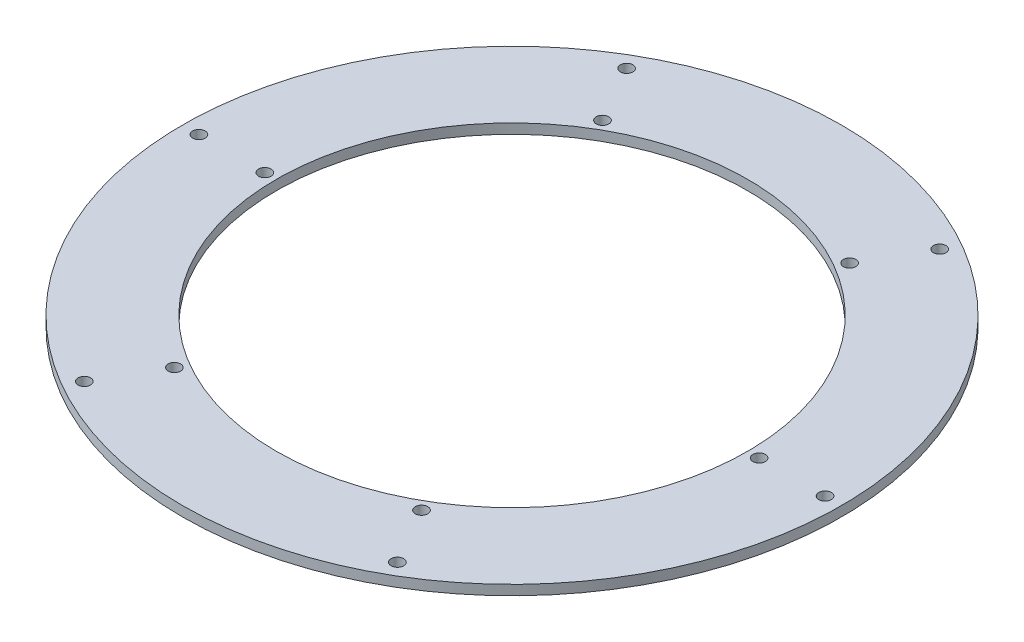
ISO-10303-21;
HEADER;
FILE_DESCRIPTION(('STEP AP214'),'2;1');
FILE_NAME('part.step','',(''),(''),'','','');
FILE_SCHEMA(('AUTOMOTIVE_DESIGN { 1 0 10303 214 1 1 1 1 }'));
ENDSEC;
DATA;
#1=APPLICATION_CONTEXT('core data for automotive mechanical design processes');
#2=APPLICATION_PROTOCOL_DEFINITION('international standard','automotive_design',2000,#1);
#3=PRODUCT_CONTEXT('',#1,'mechanical');
#4=PRODUCT('Part','Part','',(#3));
#5=PRODUCT_RELATED_PRODUCT_CATEGORY('part','',(#4));
#6=PRODUCT_DEFINITION_FORMATION('','',#4);
#7=PRODUCT_DEFINITION_CONTEXT('part definition',#1,'design');
#8=PRODUCT_DEFINITION('design','',#6,#7);
#9=PRODUCT_DEFINITION_SHAPE('','',#8);
#10=(LENGTH_UNIT() NAMED_UNIT(*) SI_UNIT(.MILLI.,.METRE.));
#11=(NAMED_UNIT(*) PLANE_ANGLE_UNIT() SI_UNIT($,.RADIAN.));
#12=(NAMED_UNIT(*) SI_UNIT($,.STERADIAN.) SOLID_ANGLE_UNIT());
#13=UNCERTAINTY_MEASURE_WITH_UNIT(LENGTH_MEASURE(1.E-05),#10,'distance_accuracy_value','');
#14=(GEOMETRIC_REPRESENTATION_CONTEXT(3) GLOBAL_UNCERTAINTY_ASSIGNED_CONTEXT((#13)) GLOBAL_UNIT_ASSIGNED_CONTEXT((#10,
#11,#12)) REPRESENTATION_CONTEXT('',''));
#15=CARTESIAN_POINT('',(0.,0.,0.));
#16=DIRECTION('',(0.,0.,1.));
#17=DIRECTION('',(1.,0.,0.));
#18=AXIS2_PLACEMENT_3D('',#15,#16,#17);
#19=CARTESIAN_POINT('',(0.,3.,0.));
#20=DIRECTION('',(0.,1.,0.));
#21=DIRECTION('',(0.,0.,1.));
#22=AXIS2_PLACEMENT_3D('',#19,#20,#21);
#23=PLANE('',#22);
#24=CARTESIAN_POINT('',(-47.500000000001,3.,-82.2724133595211));
#25=DIRECTION('',(0.,1.,0.));
#26=DIRECTION('',(0.,0.,1.));
#27=AXIS2_PLACEMENT_3D('',#24,#25,#26);
#28=CIRCLE('',#27,1.9);
#29=CARTESIAN_POINT('',(-47.500000000001,3.,-80.3724133595211));
#30=VERTEX_POINT('',#29);
#31=EDGE_CURVE('E59',#30,#30,#28,.T.);
#32=ORIENTED_EDGE('',*,*,#31,.F.);
#33=EDGE_LOOP('',(#32));
#34=FACE_BOUND('',#33,.T.);
#35=CARTESIAN_POINT('',(37.4999999999994,3.,-64.9519052838332));
#36=DIRECTION('',(0.,1.,0.));
#37=DIRECTION('',(0.,0.,1.));
#38=AXIS2_PLACEMENT_3D('',#35,#36,#37);
#39=CIRCLE('',#38,1.9);
#40=CARTESIAN_POINT('',(37.4999999999994,3.,-63.0519052838332));
#41=VERTEX_POINT('',#40);
#42=EDGE_CURVE('E64',#41,#41,#39,.T.);
#43=ORIENTED_EDGE('',*,*,#42,.F.);
#44=EDGE_LOOP('',(#43));
#45=FACE_BOUND('',#44,.T.);
#46=CARTESIAN_POINT('',(47.4999999999992,3.,-82.2724133595221));
#47=DIRECTION('',(0.,1.,0.));
#48=DIRECTION('',(0.,0.,1.));
#49=AXIS2_PLACEMENT_3D('',#46,#47,#48);
#50=CIRCLE('',#49,1.9);
#51=CARTESIAN_POINT('',(47.4999999999992,3.,-80.3724133595221));
#52=VERTEX_POINT('',#51);
#53=EDGE_CURVE('E67',#52,#52,#50,.T.);
#54=ORIENTED_EDGE('',*,*,#53,.F.);
#55=EDGE_LOOP('',(#54));
#56=FACE_BOUND('',#55,.T.);
#57=CARTESIAN_POINT('',(75.,3.,0.));
#58=DIRECTION('',(0.,1.,0.));
#59=DIRECTION('',(0.,0.,1.));
#60=AXIS2_PLACEMENT_3D('',#57,#58,#59);
#61=CIRCLE('',#60,1.9);
#62=CARTESIAN_POINT('',(75.,3.,1.9));
#63=VERTEX_POINT('',#62);
#64=EDGE_CURVE('E70',#63,#63,#61,.T.);
#65=ORIENTED_EDGE('',*,*,#64,.F.);
#66=EDGE_LOOP('',(#65));
#67=FACE_BOUND('',#66,.T.);
#68=CARTESIAN_POINT('',(-37.4999999999998,3.,64.951905283833));
#69=DIRECTION('',(0.,1.,0.));
#70=DIRECTION('',(0.,0.,1.));
#71=AXIS2_PLACEMENT_3D('',#68,#69,#70);
#72=CIRCLE('',#71,1.9);
#73=CARTESIAN_POINT('',(-37.4999999999998,3.,66.851905283833));
#74=VERTEX_POINT('',#73);
#75=EDGE_CURVE('E73',#74,#74,#72,.T.);
#76=ORIENTED_EDGE('',*,*,#75,.F.);
#77=EDGE_LOOP('',(#76));
#78=FACE_BOUND('',#77,.T.);
#79=CARTESIAN_POINT('',(47.5000000000004,3.,82.2724133595215));
#80=DIRECTION('',(0.,1.,0.));
#81=DIRECTION('',(0.,0.,1.));
#82=AXIS2_PLACEMENT_3D('',#79,#80,#81);
#83=CIRCLE('',#82,1.9);
#84=CARTESIAN_POINT('',(47.5000000000004,3.,84.1724133595215));
#85=VERTEX_POINT('',#84);
#86=EDGE_CURVE('E76',#85,#85,#83,.T.);
#87=ORIENTED_EDGE('',*,*,#86,.F.);
#88=EDGE_LOOP('',(#87));
#89=FACE_BOUND('',#88,.T.);
#90=CARTESIAN_POINT('',(37.5000000000003,3.,64.9519052838327));
#91=DIRECTION('',(0.,1.,0.));
#92=DIRECTION('',(0.,0.,1.));
#93=AXIS2_PLACEMENT_3D('',#90,#91,#92);
#94=CIRCLE('',#93,1.9);
#95=CARTESIAN_POINT('',(37.5000000000003,3.,66.8519052838327));
#96=VERTEX_POINT('',#95);
#97=EDGE_CURVE('E79',#96,#96,#94,.T.);
#98=ORIENTED_EDGE('',*,*,#97,.F.);
#99=EDGE_LOOP('',(#98));
#100=FACE_BOUND('',#99,.T.);
#101=CARTESIAN_POINT('',(95.,3.,0.));
#102=DIRECTION('',(0.,1.,0.));
#103=DIRECTION('',(0.,0.,1.));
#104=AXIS2_PLACEMENT_3D('',#101,#102,#103);
#105=CIRCLE('',#104,1.9);
#106=CARTESIAN_POINT('',(95.,3.,1.9));
#107=VERTEX_POINT('',#106);
#108=EDGE_CURVE('E82',#107,#107,#105,.T.);
#109=ORIENTED_EDGE('',*,*,#108,.F.);
#110=EDGE_LOOP('',(#109));
#111=FACE_BOUND('',#110,.T.);
#112=CARTESIAN_POINT('',(-37.5000000000008,3.,-64.9519052838325));
#113=DIRECTION('',(0.,1.,0.));
#114=DIRECTION('',(0.,0.,1.));
#115=AXIS2_PLACEMENT_3D('',#112,#113,#114);
#116=CIRCLE('',#115,1.9);
#117=CARTESIAN_POINT('',(-37.5000000000008,3.,-63.0519052838325));
#118=VERTEX_POINT('',#117);
#119=EDGE_CURVE('E85',#118,#118,#116,.T.);
#120=ORIENTED_EDGE('',*,*,#119,.F.);
#121=EDGE_LOOP('',(#120));
#122=FACE_BOUND('',#121,.T.);
#123=CARTESIAN_POINT('',(-47.4999999999998,3.,82.2724133595218));
#124=DIRECTION('',(0.,1.,0.));
#125=DIRECTION('',(0.,0.,1.));
#126=AXIS2_PLACEMENT_3D('',#123,#124,#125);
#127=CIRCLE('',#126,1.9);
#128=CARTESIAN_POINT('',(-47.4999999999998,3.,84.1724133595218));
#129=VERTEX_POINT('',#128);
#130=EDGE_CURVE('E88',#129,#129,#127,.T.);
#131=ORIENTED_EDGE('',*,*,#130,.F.);
#132=EDGE_LOOP('',(#131));
#133=FACE_BOUND('',#132,.T.);
#134=CARTESIAN_POINT('',(-95.,3.,0.));
#135=DIRECTION('',(0.,1.,0.));
#136=DIRECTION('',(0.,0.,1.));
#137=AXIS2_PLACEMENT_3D('',#134,#135,#136);
#138=CIRCLE('',#137,1.9);
#139=CARTESIAN_POINT('',(-95.,3.,1.9));
#140=VERTEX_POINT('',#139);
#141=EDGE_CURVE('E47',#140,#140,#138,.T.);
#142=ORIENTED_EDGE('',*,*,#141,.F.);
#143=EDGE_LOOP('',(#142));
#144=FACE_BOUND('',#143,.T.);
#145=CARTESIAN_POINT('',(-75.,3.,0.));
#146=DIRECTION('',(0.,1.,0.));
#147=DIRECTION('',(0.,0.,1.));
#148=AXIS2_PLACEMENT_3D('',#145,#146,#147);
#149=CIRCLE('',#148,1.9);
#150=CARTESIAN_POINT('',(-75.,3.,1.9));
#151=VERTEX_POINT('',#150);
#152=EDGE_CURVE('E52',#151,#151,#149,.T.);
#153=ORIENTED_EDGE('',*,*,#152,.F.);
#154=EDGE_LOOP('',(#153));
#155=FACE_BOUND('',#154,.T.);
#156=CARTESIAN_POINT('',(0.,3.,0.));
#157=DIRECTION('',(0.,1.,0.));
#158=DIRECTION('',(0.,0.,1.));
#159=AXIS2_PLACEMENT_3D('',#156,#157,#158);
#160=CIRCLE('',#159,100.);
#161=CARTESIAN_POINT('',(0.,3.,100.));
#162=VERTEX_POINT('',#161);
#163=EDGE_CURVE('E10',#162,#162,#160,.T.);
#164=ORIENTED_EDGE('',*,*,#163,.T.);
#165=EDGE_LOOP('',(#164));
#166=FACE_BOUND('',#165,.T.);
#167=CARTESIAN_POINT('',(0.,3.,0.));
#168=DIRECTION('',(0.,1.,0.));
#169=DIRECTION('',(0.,0.,1.));
#170=AXIS2_PLACEMENT_3D('',#167,#168,#169);
#171=CIRCLE('',#170,71.5);
#172=CARTESIAN_POINT('',(0.,3.,71.5));
#173=VERTEX_POINT('',#172);
#174=EDGE_CURVE('E42',#173,#173,#171,.T.);
#175=ORIENTED_EDGE('',*,*,#174,.F.);
#176=EDGE_LOOP('',(#175));
#177=FACE_BOUND('',#176,.T.);
#178=ADVANCED_FACE('F31',(#34,#45,#56,#67,#78,#89,#100,#111,#122,#133,#144,#155,#166,#177),#23,.T.);
#179=CARTESIAN_POINT('',(0.,0.,0.));
#180=DIRECTION('',(0.,1.,0.));
#181=DIRECTION('',(0.,0.,1.));
#182=AXIS2_PLACEMENT_3D('',#179,#180,#181);
#183=PLANE('',#182);
#184=CARTESIAN_POINT('',(-47.500000000001,0.,-82.2724133595211));
#185=DIRECTION('',(0.,1.,0.));
#186=DIRECTION('',(-0.866025403784433,0.,0.50000000000001));
#187=AXIS2_PLACEMENT_3D('',#184,#185,#186);
#188=CIRCLE('',#187,1.9);
#189=CARTESIAN_POINT('',(-49.1454482671914,0.,-81.3224133595211));
#190=VERTEX_POINT('',#189);
#191=EDGE_CURVE('E107',#190,#190,#188,.T.);
#192=ORIENTED_EDGE('',*,*,#191,.T.);
#193=EDGE_LOOP('',(#192));
#194=FACE_BOUND('',#193,.T.);
#195=CARTESIAN_POINT('',(37.4999999999994,0.,-64.9519052838332));
#196=DIRECTION('',(0.,1.,0.));
#197=DIRECTION('',(-0.866025403784443,0.,-0.499999999999992));
#198=AXIS2_PLACEMENT_3D('',#195,#196,#197);
#199=CIRCLE('',#198,1.9);
#200=CARTESIAN_POINT('',(35.854551732809,0.,-65.9019052838332));
#201=VERTEX_POINT('',#200);
#202=EDGE_CURVE('E110',#201,#201,#199,.T.);
#203=ORIENTED_EDGE('',*,*,#202,.T.);
#204=EDGE_LOOP('',(#203));
#205=FACE_BOUND('',#204,.T.);
#206=CARTESIAN_POINT('',(47.4999999999992,0.,-82.2724133595221));
#207=DIRECTION('',(0.,1.,0.));
#208=DIRECTION('',(-0.866025403784443,0.,-0.499999999999992));
#209=AXIS2_PLACEMENT_3D('',#206,#207,#208);
#210=CIRCLE('',#209,1.9);
#211=CARTESIAN_POINT('',(45.8545517328088,0.,-83.2224133595221));
#212=VERTEX_POINT('',#211);
#213=EDGE_CURVE('E114',#212,#212,#210,.T.);
#214=ORIENTED_EDGE('',*,*,#213,.T.);
#215=EDGE_LOOP('',(#214));
#216=FACE_BOUND('',#215,.T.);
#217=CARTESIAN_POINT('',(75.,0.,0.));
#218=DIRECTION('',(0.,1.,0.));
#219=DIRECTION('',(0.,0.,-1.));
#220=AXIS2_PLACEMENT_3D('',#217,#218,#219);
#221=CIRCLE('',#220,1.9);
#222=CARTESIAN_POINT('',(75.,0.,-1.9));
#223=VERTEX_POINT('',#222);
#224=EDGE_CURVE('E104',#223,#223,#221,.T.);
#225=ORIENTED_EDGE('',*,*,#224,.T.);
#226=EDGE_LOOP('',(#225));
#227=FACE_BOUND('',#226,.T.);
#228=CARTESIAN_POINT('',(-37.4999999999998,0.,64.951905283833));
#229=DIRECTION('',(0.,1.,0.));
#230=DIRECTION('',(0.86602540378444,0.,0.499999999999998));
#231=AXIS2_PLACEMENT_3D('',#228,#229,#230);
#232=CIRCLE('',#231,1.9);
#233=CARTESIAN_POINT('',(-35.8545517328094,0.,65.901905283833));
#234=VERTEX_POINT('',#233);
#235=EDGE_CURVE('E94',#234,#234,#232,.T.);
#236=ORIENTED_EDGE('',*,*,#235,.T.);
#237=EDGE_LOOP('',(#236));
#238=FACE_BOUND('',#237,.T.);
#239=CARTESIAN_POINT('',(47.5000000000004,0.,82.2724133595215));
#240=DIRECTION('',(0.,1.,0.));
#241=DIRECTION('',(0.866025403784436,0.,-0.500000000000004));
#242=AXIS2_PLACEMENT_3D('',#239,#240,#241);
#243=CIRCLE('',#242,1.9);
#244=CARTESIAN_POINT('',(49.1454482671908,0.,81.3224133595215));
#245=VERTEX_POINT('',#244);
#246=EDGE_CURVE('E95',#245,#245,#243,.T.);
#247=ORIENTED_EDGE('',*,*,#246,.T.);
#248=EDGE_LOOP('',(#247));
#249=FACE_BOUND('',#248,.T.);
#250=CARTESIAN_POINT('',(37.5000000000003,0.,64.9519052838327));
#251=DIRECTION('',(0.,1.,0.));
#252=DIRECTION('',(0.866025403784436,0.,-0.500000000000004));
#253=AXIS2_PLACEMENT_3D('',#250,#251,#252);
#254=CIRCLE('',#253,1.9);
#255=CARTESIAN_POINT('',(39.1454482671907,0.,64.0019052838327));
#256=VERTEX_POINT('',#255);
#257=EDGE_CURVE('E98',#256,#256,#254,.T.);
#258=ORIENTED_EDGE('',*,*,#257,.T.);
#259=EDGE_LOOP('',(#258));
#260=FACE_BOUND('',#259,.T.);
#261=CARTESIAN_POINT('',(95.,0.,0.));
#262=DIRECTION('',(0.,1.,0.));
#263=DIRECTION('',(0.,0.,-1.));
#264=AXIS2_PLACEMENT_3D('',#261,#262,#263);
#265=CIRCLE('',#264,1.9);
#266=CARTESIAN_POINT('',(95.,0.,-1.9));
#267=VERTEX_POINT('',#266);
#268=EDGE_CURVE('E101',#267,#267,#265,.T.);
#269=ORIENTED_EDGE('',*,*,#268,.T.);
#270=EDGE_LOOP('',(#269));
#271=FACE_BOUND('',#270,.T.);
#272=CARTESIAN_POINT('',(-37.5000000000008,0.,-64.9519052838325));
#273=DIRECTION('',(0.,1.,0.));
#274=DIRECTION('',(-0.866025403784433,0.,0.50000000000001));
#275=AXIS2_PLACEMENT_3D('',#272,#273,#274);
#276=CIRCLE('',#275,1.9);
#277=CARTESIAN_POINT('',(-39.1454482671912,0.,-64.0019052838324));
#278=VERTEX_POINT('',#277);
#279=EDGE_CURVE('E111',#278,#278,#276,.T.);
#280=ORIENTED_EDGE('',*,*,#279,.T.);
#281=EDGE_LOOP('',(#280));
#282=FACE_BOUND('',#281,.T.);
#283=CARTESIAN_POINT('',(-47.4999999999998,0.,82.2724133595218));
#284=DIRECTION('',(0.,1.,0.));
#285=DIRECTION('',(0.86602540378444,0.,0.499999999999998));
#286=AXIS2_PLACEMENT_3D('',#283,#284,#285);
#287=CIRCLE('',#286,1.9);
#288=CARTESIAN_POINT('',(-45.8545517328094,0.,83.2224133595218));
#289=VERTEX_POINT('',#288);
#290=EDGE_CURVE('E91',#289,#289,#287,.T.);
#291=ORIENTED_EDGE('',*,*,#290,.T.);
#292=EDGE_LOOP('',(#291));
#293=FACE_BOUND('',#292,.T.);
#294=CARTESIAN_POINT('',(-95.,0.,0.));
#295=DIRECTION('',(0.,1.,0.));
#296=DIRECTION('',(0.,0.,1.));
#297=AXIS2_PLACEMENT_3D('',#294,#295,#296);
#298=CIRCLE('',#297,1.9);
#299=CARTESIAN_POINT('',(-95.,0.,1.9));
#300=VERTEX_POINT('',#299);
#301=EDGE_CURVE('E55',#300,#300,#298,.T.);
#302=ORIENTED_EDGE('',*,*,#301,.T.);
#303=EDGE_LOOP('',(#302));
#304=FACE_BOUND('',#303,.T.);
#305=CARTESIAN_POINT('',(-75.,0.,0.));
#306=DIRECTION('',(0.,1.,0.));
#307=DIRECTION('',(0.,0.,1.));
#308=AXIS2_PLACEMENT_3D('',#305,#306,#307);
#309=CIRCLE('',#308,1.9);
#310=CARTESIAN_POINT('',(-75.,0.,1.9));
#311=VERTEX_POINT('',#310);
#312=EDGE_CURVE('E56',#311,#311,#309,.T.);
#313=ORIENTED_EDGE('',*,*,#312,.T.);
#314=EDGE_LOOP('',(#313));
#315=FACE_BOUND('',#314,.T.);
#316=CARTESIAN_POINT('',(0.,0.,0.));
#317=DIRECTION('',(0.,1.,0.));
#318=DIRECTION('',(0.,0.,1.));
#319=AXIS2_PLACEMENT_3D('',#316,#317,#318);
#320=CIRCLE('',#319,100.);
#321=CARTESIAN_POINT('',(0.,0.,100.));
#322=VERTEX_POINT('',#321);
#323=EDGE_CURVE('E35',#322,#322,#320,.T.);
#324=ORIENTED_EDGE('',*,*,#323,.F.);
#325=EDGE_LOOP('',(#324));
#326=FACE_BOUND('',#325,.T.);
#327=CARTESIAN_POINT('',(0.,0.,0.));
#328=DIRECTION('',(0.,1.,0.));
#329=DIRECTION('',(0.,0.,1.));
#330=AXIS2_PLACEMENT_3D('',#327,#328,#329);
#331=CIRCLE('',#330,71.5);
#332=CARTESIAN_POINT('',(0.,0.,71.5));
#333=VERTEX_POINT('',#332);
#334=EDGE_CURVE('E44',#333,#333,#331,.T.);
#335=ORIENTED_EDGE('',*,*,#334,.T.);
#336=EDGE_LOOP('',(#335));
#337=FACE_BOUND('',#336,.T.);
#338=ADVANCED_FACE('F122',(#194,#205,#216,#227,#238,#249,#260,#271,#282,#293,#304,#315,#326,
#337),#183,.F.);
#339=CARTESIAN_POINT('',(0.,3.,0.));
#340=DIRECTION('',(0.,-1.,0.));
#341=DIRECTION('',(0.,0.,-1.));
#342=AXIS2_PLACEMENT_3D('',#339,#340,#341);
#343=CYLINDRICAL_SURFACE('',#342,100.);
#344=ORIENTED_EDGE('',*,*,#163,.F.);
#345=EDGE_LOOP('',(#344));
#346=FACE_BOUND('',#345,.T.);
#347=ORIENTED_EDGE('',*,*,#323,.T.);
#348=EDGE_LOOP('',(#347));
#349=FACE_BOUND('',#348,.T.);
#350=ADVANCED_FACE('F33',(#346,#349),#343,.T.);
#351=CARTESIAN_POINT('',(0.,3.,0.));
#352=DIRECTION('',(0.,-1.,0.));
#353=DIRECTION('',(0.,0.,-1.));
#354=AXIS2_PLACEMENT_3D('',#351,#352,#353);
#355=CYLINDRICAL_SURFACE('',#354,71.5);
#356=ORIENTED_EDGE('',*,*,#174,.T.);
#357=EDGE_LOOP('',(#356));
#358=FACE_BOUND('',#357,.T.);
#359=ORIENTED_EDGE('',*,*,#334,.F.);
#360=EDGE_LOOP('',(#359));
#361=FACE_BOUND('',#360,.T.);
#362=ADVANCED_FACE('F152',(#358,#361),#355,.F.);
#363=CARTESIAN_POINT('',(-75.,0.,0.));
#364=DIRECTION('',(0.,1.,0.));
#365=DIRECTION('',(0.,0.,1.));
#366=AXIS2_PLACEMENT_3D('',#363,#364,#365);
#367=CYLINDRICAL_SURFACE('',#366,1.9);
#368=ORIENTED_EDGE('',*,*,#152,.T.);
#369=EDGE_LOOP('',(#368));
#370=FACE_BOUND('',#369,.T.);
#371=ORIENTED_EDGE('',*,*,#312,.F.);
#372=EDGE_LOOP('',(#371));
#373=FACE_BOUND('',#372,.T.);
#374=ADVANCED_FACE('F155',(#370,#373),#367,.F.);
#375=CARTESIAN_POINT('',(-95.,0.,0.));
#376=DIRECTION('',(0.,1.,0.));
#377=DIRECTION('',(0.,0.,1.));
#378=AXIS2_PLACEMENT_3D('',#375,#376,#377);
#379=CYLINDRICAL_SURFACE('',#378,1.9);
#380=ORIENTED_EDGE('',*,*,#141,.T.);
#381=EDGE_LOOP('',(#380));
#382=FACE_BOUND('',#381,.T.);
#383=ORIENTED_EDGE('',*,*,#301,.F.);
#384=EDGE_LOOP('',(#383));
#385=FACE_BOUND('',#384,.T.);
#386=ADVANCED_FACE('F138',(#382,#385),#379,.F.);
#387=CARTESIAN_POINT('',(-47.4999999999998,0.,82.2724133595218));
#388=DIRECTION('',(0.,1.,0.));
#389=DIRECTION('',(0.,0.,1.));
#390=AXIS2_PLACEMENT_3D('',#387,#388,#389);
#391=CYLINDRICAL_SURFACE('',#390,1.9);
#392=ORIENTED_EDGE('',*,*,#130,.T.);
#393=EDGE_LOOP('',(#392));
#394=FACE_BOUND('',#393,.T.);
#395=ORIENTED_EDGE('',*,*,#290,.F.);
#396=EDGE_LOOP('',(#395));
#397=FACE_BOUND('',#396,.T.);
#398=ADVANCED_FACE('F128',(#394,#397),#391,.F.);
#399=CARTESIAN_POINT('',(-37.5000000000008,0.,-64.9519052838325));
#400=DIRECTION('',(0.,1.,0.));
#401=DIRECTION('',(0.,0.,1.));
#402=AXIS2_PLACEMENT_3D('',#399,#400,#401);
#403=CYLINDRICAL_SURFACE('',#402,1.9);
#404=ORIENTED_EDGE('',*,*,#119,.T.);
#405=EDGE_LOOP('',(#404));
#406=FACE_BOUND('',#405,.T.);
#407=ORIENTED_EDGE('',*,*,#279,.F.);
#408=EDGE_LOOP('',(#407));
#409=FACE_BOUND('',#408,.T.);
#410=ADVANCED_FACE('F125',(#406,#409),#403,.F.);
#411=CARTESIAN_POINT('',(95.,0.,0.));
#412=DIRECTION('',(0.,1.,0.));
#413=DIRECTION('',(0.,0.,1.));
#414=AXIS2_PLACEMENT_3D('',#411,#412,#413);
#415=CYLINDRICAL_SURFACE('',#414,1.9);
#416=ORIENTED_EDGE('',*,*,#108,.T.);
#417=EDGE_LOOP('',(#416));
#418=FACE_BOUND('',#417,.T.);
#419=ORIENTED_EDGE('',*,*,#268,.F.);
#420=EDGE_LOOP('',(#419));
#421=FACE_BOUND('',#420,.T.);
#422=ADVANCED_FACE('F127',(#418,#421),#415,.F.);
#423=CARTESIAN_POINT('',(37.5000000000003,0.,64.9519052838327));
#424=DIRECTION('',(0.,1.,0.));
#425=DIRECTION('',(0.,0.,1.));
#426=AXIS2_PLACEMENT_3D('',#423,#424,#425);
#427=CYLINDRICAL_SURFACE('',#426,1.9);
#428=ORIENTED_EDGE('',*,*,#97,.T.);
#429=EDGE_LOOP('',(#428));
#430=FACE_BOUND('',#429,.T.);
#431=ORIENTED_EDGE('',*,*,#257,.F.);
#432=EDGE_LOOP('',(#431));
#433=FACE_BOUND('',#432,.T.);
#434=ADVANCED_FACE('F135',(#430,#433),#427,.F.);
#435=CARTESIAN_POINT('',(47.5000000000004,0.,82.2724133595215));
#436=DIRECTION('',(0.,1.,0.));
#437=DIRECTION('',(0.,0.,1.));
#438=AXIS2_PLACEMENT_3D('',#435,#436,#437);
#439=CYLINDRICAL_SURFACE('',#438,1.9);
#440=ORIENTED_EDGE('',*,*,#86,.T.);
#441=EDGE_LOOP('',(#440));
#442=FACE_BOUND('',#441,.T.);
#443=ORIENTED_EDGE('',*,*,#246,.F.);
#444=EDGE_LOOP('',(#443));
#445=FACE_BOUND('',#444,.T.);
#446=ADVANCED_FACE('F163',(#442,#445),#439,.F.);
#447=CARTESIAN_POINT('',(-37.4999999999998,0.,64.951905283833));
#448=DIRECTION('',(0.,1.,0.));
#449=DIRECTION('',(0.,0.,1.));
#450=AXIS2_PLACEMENT_3D('',#447,#448,#449);
#451=CYLINDRICAL_SURFACE('',#450,1.9);
#452=ORIENTED_EDGE('',*,*,#75,.T.);
#453=EDGE_LOOP('',(#452));
#454=FACE_BOUND('',#453,.T.);
#455=ORIENTED_EDGE('',*,*,#235,.F.);
#456=EDGE_LOOP('',(#455));
#457=FACE_BOUND('',#456,.T.);
#458=ADVANCED_FACE('F166',(#454,#457),#451,.F.);
#459=CARTESIAN_POINT('',(75.,0.,0.));
#460=DIRECTION('',(0.,1.,0.));
#461=DIRECTION('',(0.,0.,1.));
#462=AXIS2_PLACEMENT_3D('',#459,#460,#461);
#463=CYLINDRICAL_SURFACE('',#462,1.9);
#464=ORIENTED_EDGE('',*,*,#64,.T.);
#465=EDGE_LOOP('',(#464));
#466=FACE_BOUND('',#465,.T.);
#467=ORIENTED_EDGE('',*,*,#224,.F.);
#468=EDGE_LOOP('',(#467));
#469=FACE_BOUND('',#468,.T.);
#470=ADVANCED_FACE('F169',(#466,#469),#463,.F.);
#471=CARTESIAN_POINT('',(47.4999999999992,0.,-82.2724133595221));
#472=DIRECTION('',(0.,1.,0.));
#473=DIRECTION('',(0.,0.,1.));
#474=AXIS2_PLACEMENT_3D('',#471,#472,#473);
#475=CYLINDRICAL_SURFACE('',#474,1.9);
#476=ORIENTED_EDGE('',*,*,#53,.T.);
#477=EDGE_LOOP('',(#476));
#478=FACE_BOUND('',#477,.T.);
#479=ORIENTED_EDGE('',*,*,#213,.F.);
#480=EDGE_LOOP('',(#479));
#481=FACE_BOUND('',#480,.T.);
#482=ADVANCED_FACE('F182',(#478,#481),#475,.F.);
#483=CARTESIAN_POINT('',(37.4999999999994,0.,-64.9519052838332));
#484=DIRECTION('',(0.,1.,0.));
#485=DIRECTION('',(0.,0.,1.));
#486=AXIS2_PLACEMENT_3D('',#483,#484,#485);
#487=CYLINDRICAL_SURFACE('',#486,1.9);
#488=ORIENTED_EDGE('',*,*,#42,.T.);
#489=EDGE_LOOP('',(#488));
#490=FACE_BOUND('',#489,.T.);
#491=ORIENTED_EDGE('',*,*,#202,.F.);
#492=EDGE_LOOP('',(#491));
#493=FACE_BOUND('',#492,.T.);
#494=ADVANCED_FACE('F178',(#490,#493),#487,.F.);
#495=CARTESIAN_POINT('',(-47.500000000001,0.,-82.2724133595211));
#496=DIRECTION('',(0.,1.,0.));
#497=DIRECTION('',(0.,0.,1.));
#498=AXIS2_PLACEMENT_3D('',#495,#496,#497);
#499=CYLINDRICAL_SURFACE('',#498,1.9);
#500=ORIENTED_EDGE('',*,*,#31,.T.);
#501=EDGE_LOOP('',(#500));
#502=FACE_BOUND('',#501,.T.);
#503=ORIENTED_EDGE('',*,*,#191,.F.);
#504=EDGE_LOOP('',(#503));
#505=FACE_BOUND('',#504,.T.);
#506=ADVANCED_FACE('F175',(#502,#505),#499,.F.);
#507=CLOSED_SHELL('',(#178,#338,#350,#362,#374,#386,#398,#410,#422,#434,#446,#458,#470,#482,
#494,#506));
#508=MANIFOLD_SOLID_BREP('B2',#507);
#509=ADVANCED_BREP_SHAPE_REPRESENTATION('',(#18,#508),#14);
#510=SHAPE_DEFINITION_REPRESENTATION(#9,#509);
ENDSEC;
END-ISO-10303-21;
